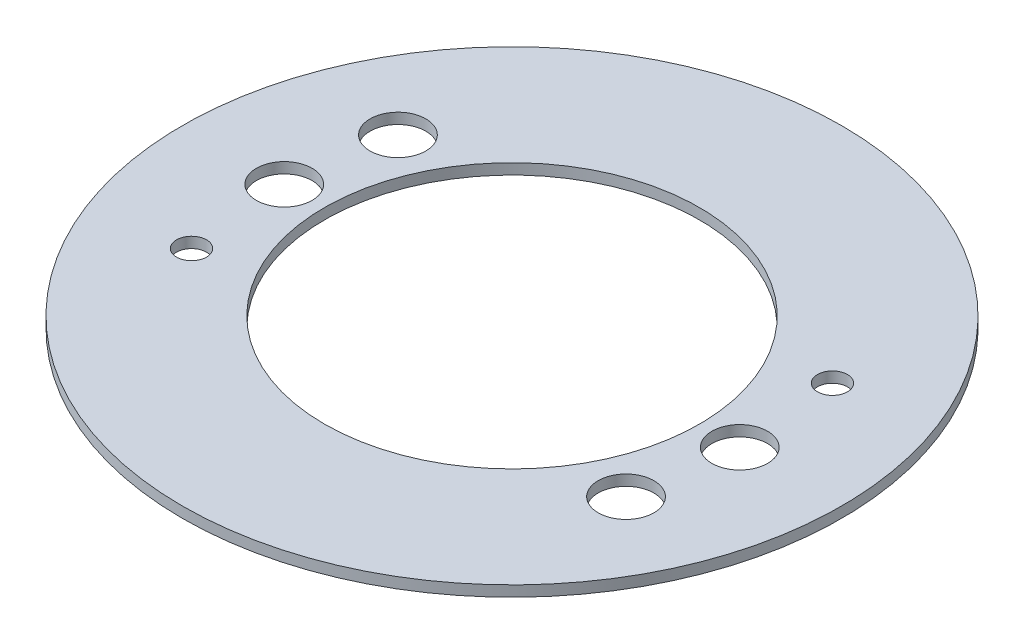
ISO-10303-21;
HEADER;
FILE_DESCRIPTION(('STEP AP214'),'2;1');
FILE_NAME('part.step','',(''),(''),'','','');
FILE_SCHEMA(('AUTOMOTIVE_DESIGN { 1 0 10303 214 1 1 1 1 }'));
ENDSEC;
DATA;
#1=APPLICATION_CONTEXT('core data for automotive mechanical design processes');
#2=APPLICATION_PROTOCOL_DEFINITION('international standard','automotive_design',2000,#1);
#3=PRODUCT_CONTEXT('',#1,'mechanical');
#4=PRODUCT('Part','Part','',(#3));
#5=PRODUCT_RELATED_PRODUCT_CATEGORY('part','',(#4));
#6=PRODUCT_DEFINITION_FORMATION('','',#4);
#7=PRODUCT_DEFINITION_CONTEXT('part definition',#1,'design');
#8=PRODUCT_DEFINITION('design','',#6,#7);
#9=PRODUCT_DEFINITION_SHAPE('','',#8);
#10=(LENGTH_UNIT() NAMED_UNIT(*) SI_UNIT(.MILLI.,.METRE.));
#11=(NAMED_UNIT(*) PLANE_ANGLE_UNIT() SI_UNIT($,.RADIAN.));
#12=(NAMED_UNIT(*) SI_UNIT($,.STERADIAN.) SOLID_ANGLE_UNIT());
#13=UNCERTAINTY_MEASURE_WITH_UNIT(LENGTH_MEASURE(1.E-05),#10,'distance_accuracy_value','');
#14=(GEOMETRIC_REPRESENTATION_CONTEXT(3) GLOBAL_UNCERTAINTY_ASSIGNED_CONTEXT((#13)) GLOBAL_UNIT_ASSIGNED_CONTEXT((#10,
#11,#12)) REPRESENTATION_CONTEXT('',''));
#15=CARTESIAN_POINT('',(0.,0.,0.));
#16=DIRECTION('',(0.,0.,1.));
#17=DIRECTION('',(1.,0.,0.));
#18=AXIS2_PLACEMENT_3D('',#15,#16,#17);
#19=CARTESIAN_POINT('',(0.,2.54,0.));
#20=DIRECTION('',(0.,1.,0.));
#21=DIRECTION('',(0.,0.,1.));
#22=AXIS2_PLACEMENT_3D('',#19,#20,#21);
#23=PLANE('',#22);
#24=CARTESIAN_POINT('',(50.644479139608,2.54,23.6159084660704));
#25=DIRECTION('',(0.,1.,0.));
#26=DIRECTION('',(0.,0.,1.));
#27=AXIS2_PLACEMENT_3D('',#24,#25,#26);
#28=CIRCLE('',#27,6.604);
#29=CARTESIAN_POINT('',(50.644479139608,2.54,30.2199084660704));
#30=VERTEX_POINT('',#29);
#31=EDGE_CURVE('E79',#30,#30,#28,.T.);
#32=ORIENTED_EDGE('',*,*,#31,.F.);
#33=EDGE_LOOP('',(#32));
#34=FACE_BOUND('',#33,.T.);
#35=CARTESIAN_POINT('',(51.7954900291445,2.54,-24.152633658481));
#36=DIRECTION('',(0.,1.,0.));
#37=DIRECTION('',(0.,0.,1.));
#38=AXIS2_PLACEMENT_3D('',#35,#36,#37);
#39=CIRCLE('',#38,3.55600000000001);
#40=CARTESIAN_POINT('',(51.7954900291445,2.54,-20.596633658481));
#41=VERTEX_POINT('',#40);
#42=EDGE_CURVE('E68',#41,#41,#39,.T.);
#43=ORIENTED_EDGE('',*,*,#42,.F.);
#44=EDGE_LOOP('',(#43));
#45=FACE_BOUND('',#44,.T.);
#46=CARTESIAN_POINT('',(-51.7954900291445,2.54,24.152633658481));
#47=DIRECTION('',(0.,1.,0.));
#48=DIRECTION('',(0.,0.,1.));
#49=AXIS2_PLACEMENT_3D('',#46,#47,#48);
#50=CIRCLE('',#49,3.55600000000001);
#51=CARTESIAN_POINT('',(-51.7954900291445,2.54,27.7086336584811));
#52=VERTEX_POINT('',#51);
#53=EDGE_CURVE('E67',#52,#52,#50,.T.);
#54=ORIENTED_EDGE('',*,*,#53,.F.);
#55=EDGE_LOOP('',(#54));
#56=FACE_BOUND('',#55,.T.);
#57=CARTESIAN_POINT('',(53.975,2.54,0.));
#58=DIRECTION('',(0.,1.,0.));
#59=DIRECTION('',(0.,0.,1.));
#60=AXIS2_PLACEMENT_3D('',#57,#58,#59);
#61=CIRCLE('',#60,6.604);
#62=CARTESIAN_POINT('',(53.975,2.54,6.60399999999998));
#63=VERTEX_POINT('',#62);
#64=EDGE_CURVE('E61',#63,#63,#61,.T.);
#65=ORIENTED_EDGE('',*,*,#64,.F.);
#66=EDGE_LOOP('',(#65));
#67=FACE_BOUND('',#66,.T.);
#68=CARTESIAN_POINT('',(-50.6444791396082,2.54,-23.61590846607));
#69=DIRECTION('',(0.,1.,0.));
#70=DIRECTION('',(0.,0.,1.));
#71=AXIS2_PLACEMENT_3D('',#68,#69,#70);
#72=CIRCLE('',#71,6.604);
#73=CARTESIAN_POINT('',(-50.6444791396082,2.54,-17.01190846607));
#74=VERTEX_POINT('',#73);
#75=EDGE_CURVE('E80',#74,#74,#72,.T.);
#76=ORIENTED_EDGE('',*,*,#75,.F.);
#77=EDGE_LOOP('',(#76));
#78=FACE_BOUND('',#77,.T.);
#79=CARTESIAN_POINT('',(-53.975,2.54,0.));
#80=DIRECTION('',(0.,1.,0.));
#81=DIRECTION('',(0.,0.,1.));
#82=AXIS2_PLACEMENT_3D('',#79,#80,#81);
#83=CIRCLE('',#82,6.604);
#84=CARTESIAN_POINT('',(-53.975,2.54,6.60400000000001));
#85=VERTEX_POINT('',#84);
#86=EDGE_CURVE('E58',#85,#85,#83,.T.);
#87=ORIENTED_EDGE('',*,*,#86,.F.);
#88=EDGE_LOOP('',(#87));
#89=FACE_BOUND('',#88,.T.);
#90=CARTESIAN_POINT('',(0.,2.54,0.));
#91=DIRECTION('',(0.,1.,0.));
#92=DIRECTION('',(0.,0.,1.));
#93=AXIS2_PLACEMENT_3D('',#90,#91,#92);
#94=CIRCLE('',#93,78.105);
#95=CARTESIAN_POINT('',(0.,2.54,78.105));
#96=VERTEX_POINT('',#95);
#97=EDGE_CURVE('E10',#96,#96,#94,.T.);
#98=ORIENTED_EDGE('',*,*,#97,.T.);
#99=EDGE_LOOP('',(#98));
#100=FACE_BOUND('',#99,.T.);
#101=CARTESIAN_POINT('',(0.,2.54,0.));
#102=DIRECTION('',(0.,1.,0.));
#103=DIRECTION('',(0.,0.,1.));
#104=AXIS2_PLACEMENT_3D('',#101,#102,#103);
#105=CIRCLE('',#104,44.45);
#106=CARTESIAN_POINT('',(0.,2.54,44.45));
#107=VERTEX_POINT('',#106);
#108=EDGE_CURVE('E50',#107,#107,#105,.T.);
#109=ORIENTED_EDGE('',*,*,#108,.F.);
#110=EDGE_LOOP('',(#109));
#111=FACE_BOUND('',#110,.T.);
#112=ADVANCED_FACE('F39',(#34,#45,#56,#67,#78,#89,#100,#111),#23,.T.);
#113=CARTESIAN_POINT('',(0.,0.,0.));
#114=DIRECTION('',(0.,1.,0.));
#115=DIRECTION('',(0.,0.,1.));
#116=AXIS2_PLACEMENT_3D('',#113,#114,#115);
#117=PLANE('',#116);
#118=CARTESIAN_POINT('',(50.644479139608,0.,23.6159084660704));
#119=DIRECTION('',(0.,1.,0.));
#120=DIRECTION('',(0.,0.,1.));
#121=AXIS2_PLACEMENT_3D('',#118,#119,#120);
#122=CIRCLE('',#121,6.604);
#123=CARTESIAN_POINT('',(50.644479139608,0.,30.2199084660704));
#124=VERTEX_POINT('',#123);
#125=EDGE_CURVE('E76',#124,#124,#122,.T.);
#126=ORIENTED_EDGE('',*,*,#125,.T.);
#127=EDGE_LOOP('',(#126));
#128=FACE_BOUND('',#127,.T.);
#129=CARTESIAN_POINT('',(51.7954900291445,0.,-24.152633658481));
#130=DIRECTION('',(0.,1.,0.));
#131=DIRECTION('',(0.,0.,1.));
#132=AXIS2_PLACEMENT_3D('',#129,#130,#131);
#133=CIRCLE('',#132,3.55600000000001);
#134=CARTESIAN_POINT('',(51.7954900291445,0.,-20.596633658481));
#135=VERTEX_POINT('',#134);
#136=EDGE_CURVE('E83',#135,#135,#133,.T.);
#137=ORIENTED_EDGE('',*,*,#136,.T.);
#138=EDGE_LOOP('',(#137));
#139=FACE_BOUND('',#138,.T.);
#140=CARTESIAN_POINT('',(-51.7954900291445,0.,24.152633658481));
#141=DIRECTION('',(0.,1.,0.));
#142=DIRECTION('',(0.,0.,1.));
#143=AXIS2_PLACEMENT_3D('',#140,#141,#142);
#144=CIRCLE('',#143,3.55600000000001);
#145=CARTESIAN_POINT('',(-51.7954900291445,0.,27.7086336584811));
#146=VERTEX_POINT('',#145);
#147=EDGE_CURVE('E64',#146,#146,#144,.T.);
#148=ORIENTED_EDGE('',*,*,#147,.T.);
#149=EDGE_LOOP('',(#148));
#150=FACE_BOUND('',#149,.T.);
#151=CARTESIAN_POINT('',(53.975,0.,0.));
#152=DIRECTION('',(0.,1.,0.));
#153=DIRECTION('',(0.,0.,1.));
#154=AXIS2_PLACEMENT_3D('',#151,#152,#153);
#155=CIRCLE('',#154,6.604);
#156=CARTESIAN_POINT('',(53.975,0.,6.60399999999998));
#157=VERTEX_POINT('',#156);
#158=EDGE_CURVE('E71',#157,#157,#155,.T.);
#159=ORIENTED_EDGE('',*,*,#158,.T.);
#160=EDGE_LOOP('',(#159));
#161=FACE_BOUND('',#160,.T.);
#162=CARTESIAN_POINT('',(-50.6444791396082,0.,-23.61590846607));
#163=DIRECTION('',(0.,1.,0.));
#164=DIRECTION('',(0.,0.,1.));
#165=AXIS2_PLACEMENT_3D('',#162,#163,#164);
#166=CIRCLE('',#165,6.604);
#167=CARTESIAN_POINT('',(-50.6444791396082,0.,-17.01190846607));
#168=VERTEX_POINT('',#167);
#169=EDGE_CURVE('E88',#168,#168,#166,.T.);
#170=ORIENTED_EDGE('',*,*,#169,.T.);
#171=EDGE_LOOP('',(#170));
#172=FACE_BOUND('',#171,.T.);
#173=CARTESIAN_POINT('',(-53.975,0.,0.));
#174=DIRECTION('',(0.,1.,0.));
#175=DIRECTION('',(0.,0.,1.));
#176=AXIS2_PLACEMENT_3D('',#173,#174,#175);
#177=CIRCLE('',#176,6.604);
#178=CARTESIAN_POINT('',(-53.975,0.,6.60400000000001));
#179=VERTEX_POINT('',#178);
#180=EDGE_CURVE('E55',#179,#179,#177,.T.);
#181=ORIENTED_EDGE('',*,*,#180,.T.);
#182=EDGE_LOOP('',(#181));
#183=FACE_BOUND('',#182,.T.);
#184=CARTESIAN_POINT('',(0.,0.,0.));
#185=DIRECTION('',(0.,1.,0.));
#186=DIRECTION('',(0.,0.,1.));
#187=AXIS2_PLACEMENT_3D('',#184,#185,#186);
#188=CIRCLE('',#187,78.105);
#189=CARTESIAN_POINT('',(0.,0.,78.105));
#190=VERTEX_POINT('',#189);
#191=EDGE_CURVE('E43',#190,#190,#188,.T.);
#192=ORIENTED_EDGE('',*,*,#191,.F.);
#193=EDGE_LOOP('',(#192));
#194=FACE_BOUND('',#193,.T.);
#195=CARTESIAN_POINT('',(0.,0.,0.));
#196=DIRECTION('',(0.,1.,0.));
#197=DIRECTION('',(0.,0.,1.));
#198=AXIS2_PLACEMENT_3D('',#195,#196,#197);
#199=CIRCLE('',#198,44.45);
#200=CARTESIAN_POINT('',(0.,0.,44.45));
#201=VERTEX_POINT('',#200);
#202=EDGE_CURVE('E52',#201,#201,#199,.T.);
#203=ORIENTED_EDGE('',*,*,#202,.T.);
#204=EDGE_LOOP('',(#203));
#205=FACE_BOUND('',#204,.T.);
#206=ADVANCED_FACE('F98',(#128,#139,#150,#161,#172,#183,#194,#205),#117,.F.);
#207=CARTESIAN_POINT('',(0.,2.54,0.));
#208=DIRECTION('',(0.,-1.,0.));
#209=DIRECTION('',(0.,0.,-1.));
#210=AXIS2_PLACEMENT_3D('',#207,#208,#209);
#211=CYLINDRICAL_SURFACE('',#210,78.105);
#212=ORIENTED_EDGE('',*,*,#97,.F.);
#213=EDGE_LOOP('',(#212));
#214=FACE_BOUND('',#213,.T.);
#215=ORIENTED_EDGE('',*,*,#191,.T.);
#216=EDGE_LOOP('',(#215));
#217=FACE_BOUND('',#216,.T.);
#218=ADVANCED_FACE('F41',(#214,#217),#211,.T.);
#219=CARTESIAN_POINT('',(0.,2.54,0.));
#220=DIRECTION('',(0.,-1.,0.));
#221=DIRECTION('',(0.,0.,-1.));
#222=AXIS2_PLACEMENT_3D('',#219,#220,#221);
#223=CYLINDRICAL_SURFACE('',#222,44.45);
#224=ORIENTED_EDGE('',*,*,#108,.T.);
#225=EDGE_LOOP('',(#224));
#226=FACE_BOUND('',#225,.T.);
#227=ORIENTED_EDGE('',*,*,#202,.F.);
#228=EDGE_LOOP('',(#227));
#229=FACE_BOUND('',#228,.T.);
#230=ADVANCED_FACE('F105',(#226,#229),#223,.F.);
#231=CARTESIAN_POINT('',(-53.975,0.,0.));
#232=DIRECTION('',(0.,1.,0.));
#233=DIRECTION('',(0.,0.,1.));
#234=AXIS2_PLACEMENT_3D('',#231,#232,#233);
#235=CYLINDRICAL_SURFACE('',#234,6.604);
#236=ORIENTED_EDGE('',*,*,#180,.F.);
#237=EDGE_LOOP('',(#236));
#238=FACE_BOUND('',#237,.T.);
#239=ORIENTED_EDGE('',*,*,#86,.T.);
#240=EDGE_LOOP('',(#239));
#241=FACE_BOUND('',#240,.T.);
#242=ADVANCED_FACE('F108',(#238,#241),#235,.F.);
#243=CARTESIAN_POINT('',(-50.6444791396082,0.,-23.61590846607));
#244=DIRECTION('',(0.,1.,0.));
#245=DIRECTION('',(0.,0.,1.));
#246=AXIS2_PLACEMENT_3D('',#243,#244,#245);
#247=CYLINDRICAL_SURFACE('',#246,6.604);
#248=ORIENTED_EDGE('',*,*,#169,.F.);
#249=EDGE_LOOP('',(#248));
#250=FACE_BOUND('',#249,.T.);
#251=ORIENTED_EDGE('',*,*,#75,.T.);
#252=EDGE_LOOP('',(#251));
#253=FACE_BOUND('',#252,.T.);
#254=ADVANCED_FACE('F94',(#250,#253),#247,.F.);
#255=CARTESIAN_POINT('',(53.975,0.,0.));
#256=DIRECTION('',(0.,1.,0.));
#257=DIRECTION('',(0.,0.,1.));
#258=AXIS2_PLACEMENT_3D('',#255,#256,#257);
#259=CYLINDRICAL_SURFACE('',#258,6.604);
#260=ORIENTED_EDGE('',*,*,#158,.F.);
#261=EDGE_LOOP('',(#260));
#262=FACE_BOUND('',#261,.T.);
#263=ORIENTED_EDGE('',*,*,#64,.T.);
#264=EDGE_LOOP('',(#263));
#265=FACE_BOUND('',#264,.T.);
#266=ADVANCED_FACE('F127',(#262,#265),#259,.F.);
#267=CARTESIAN_POINT('',(-51.7954900291445,0.,24.152633658481));
#268=DIRECTION('',(0.,1.,0.));
#269=DIRECTION('',(0.,0.,1.));
#270=AXIS2_PLACEMENT_3D('',#267,#268,#269);
#271=CYLINDRICAL_SURFACE('',#270,3.55600000000001);
#272=ORIENTED_EDGE('',*,*,#147,.F.);
#273=EDGE_LOOP('',(#272));
#274=FACE_BOUND('',#273,.T.);
#275=ORIENTED_EDGE('',*,*,#53,.T.);
#276=EDGE_LOOP('',(#275));
#277=FACE_BOUND('',#276,.T.);
#278=ADVANCED_FACE('F123',(#274,#277),#271,.F.);
#279=CARTESIAN_POINT('',(51.7954900291445,0.,-24.152633658481));
#280=DIRECTION('',(0.,1.,0.));
#281=DIRECTION('',(0.,0.,1.));
#282=AXIS2_PLACEMENT_3D('',#279,#280,#281);
#283=CYLINDRICAL_SURFACE('',#282,3.55600000000001);
#284=ORIENTED_EDGE('',*,*,#136,.F.);
#285=EDGE_LOOP('',(#284));
#286=FACE_BOUND('',#285,.T.);
#287=ORIENTED_EDGE('',*,*,#42,.T.);
#288=EDGE_LOOP('',(#287));
#289=FACE_BOUND('',#288,.T.);
#290=ADVANCED_FACE('F126',(#286,#289),#283,.F.);
#291=CARTESIAN_POINT('',(50.644479139608,0.,23.6159084660704));
#292=DIRECTION('',(0.,1.,0.));
#293=DIRECTION('',(0.,0.,1.));
#294=AXIS2_PLACEMENT_3D('',#291,#292,#293);
#295=CYLINDRICAL_SURFACE('',#294,6.604);
#296=ORIENTED_EDGE('',*,*,#125,.F.);
#297=EDGE_LOOP('',(#296));
#298=FACE_BOUND('',#297,.T.);
#299=ORIENTED_EDGE('',*,*,#31,.T.);
#300=EDGE_LOOP('',(#299));
#301=FACE_BOUND('',#300,.T.);
#302=ADVANCED_FACE('F132',(#298,#301),#295,.F.);
#303=CLOSED_SHELL('',(#112,#206,#218,#230,#242,#254,#266,#278,#290,#302));
#304=MANIFOLD_SOLID_BREP('B2',#303);
#305=ADVANCED_BREP_SHAPE_REPRESENTATION('',(#18,#304),#14);
#306=SHAPE_DEFINITION_REPRESENTATION(#9,#305);
ENDSEC;
END-ISO-10303-21;
